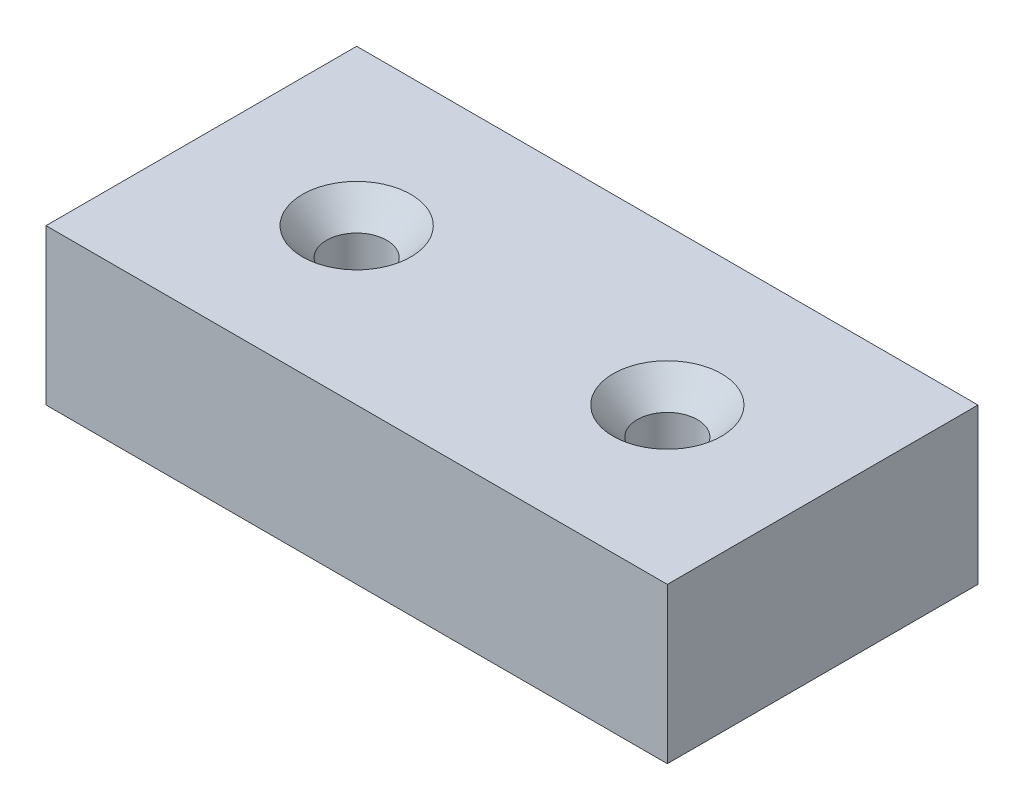
ISO-10303-21;
HEADER;
FILE_DESCRIPTION(('STEP AP214'),'2;1');
FILE_NAME('part.step','',(''),(''),'','','');
FILE_SCHEMA(('AUTOMOTIVE_DESIGN { 1 0 10303 214 1 1 1 1 }'));
ENDSEC;
DATA;
#1=APPLICATION_CONTEXT('core data for automotive mechanical design processes');
#2=APPLICATION_PROTOCOL_DEFINITION('international standard','automotive_design',2000,#1);
#3=PRODUCT_CONTEXT('',#1,'mechanical');
#4=PRODUCT('Part','Part','',(#3));
#5=PRODUCT_RELATED_PRODUCT_CATEGORY('part','',(#4));
#6=PRODUCT_DEFINITION_FORMATION('','',#4);
#7=PRODUCT_DEFINITION_CONTEXT('part definition',#1,'design');
#8=PRODUCT_DEFINITION('design','',#6,#7);
#9=PRODUCT_DEFINITION_SHAPE('','',#8);
#10=(LENGTH_UNIT() NAMED_UNIT(*) SI_UNIT(.MILLI.,.METRE.));
#11=(NAMED_UNIT(*) PLANE_ANGLE_UNIT() SI_UNIT($,.RADIAN.));
#12=(NAMED_UNIT(*) SI_UNIT($,.STERADIAN.) SOLID_ANGLE_UNIT());
#13=UNCERTAINTY_MEASURE_WITH_UNIT(LENGTH_MEASURE(1.E-05),#10,'distance_accuracy_value','');
#14=(GEOMETRIC_REPRESENTATION_CONTEXT(3) GLOBAL_UNCERTAINTY_ASSIGNED_CONTEXT((#13)) GLOBAL_UNIT_ASSIGNED_CONTEXT((#10,
#11,#12)) REPRESENTATION_CONTEXT('',''));
#15=CARTESIAN_POINT('',(0.,0.,0.));
#16=DIRECTION('',(0.,0.,1.));
#17=DIRECTION('',(1.,0.,0.));
#18=AXIS2_PLACEMENT_3D('',#15,#16,#17);
#19=CARTESIAN_POINT('',(-25.4,-6.35,12.7));
#20=DIRECTION('',(0.,0.,1.));
#21=DIRECTION('',(1.,0.,0.));
#22=AXIS2_PLACEMENT_3D('',#19,#20,#21);
#23=PLANE('',#22);
#24=DIRECTION('',(1.,0.,0.));
#25=VECTOR('',#24,1.);
#26=CARTESIAN_POINT('',(-25.4,6.35,12.7));
#27=LINE('',#26,#25);
#28=CARTESIAN_POINT('',(-25.4,6.35,12.7));
#29=VERTEX_POINT('',#28);
#30=CARTESIAN_POINT('',(25.4,6.35,12.7));
#31=VERTEX_POINT('',#30);
#32=EDGE_CURVE('E106',#29,#31,#27,.T.);
#33=ORIENTED_EDGE('',*,*,#32,.F.);
#34=DIRECTION('',(0.,1.,0.));
#35=VECTOR('',#34,1.);
#36=CARTESIAN_POINT('',(-25.4,-6.35,12.7));
#37=LINE('',#36,#35);
#38=CARTESIAN_POINT('',(-25.4,-6.35,12.7));
#39=VERTEX_POINT('',#38);
#40=EDGE_CURVE('E55',#39,#29,#37,.T.);
#41=ORIENTED_EDGE('',*,*,#40,.F.);
#42=DIRECTION('',(1.,0.,0.));
#43=VECTOR('',#42,1.);
#44=CARTESIAN_POINT('',(-25.4,-6.35,12.7));
#45=LINE('',#44,#43);
#46=CARTESIAN_POINT('',(25.4,-6.35,12.7));
#47=VERTEX_POINT('',#46);
#48=EDGE_CURVE('E100',#39,#47,#45,.T.);
#49=ORIENTED_EDGE('',*,*,#48,.T.);
#50=DIRECTION('',(0.,1.,0.));
#51=VECTOR('',#50,1.);
#52=CARTESIAN_POINT('',(25.4,-6.35,12.7));
#53=LINE('',#52,#51);
#54=EDGE_CURVE('E83',#47,#31,#53,.T.);
#55=ORIENTED_EDGE('',*,*,#54,.T.);
#56=EDGE_LOOP('',(#33,#41,#49,#55));
#57=FACE_BOUND('',#56,.T.);
#58=ADVANCED_FACE('F38',(#57),#23,.T.);
#59=CARTESIAN_POINT('',(-25.4,-6.35,-12.7));
#60=DIRECTION('',(-1.,0.,0.));
#61=DIRECTION('',(0.,0.,1.));
#62=AXIS2_PLACEMENT_3D('',#59,#60,#61);
#63=PLANE('',#62);
#64=DIRECTION('',(0.,0.,1.));
#65=VECTOR('',#64,1.);
#66=CARTESIAN_POINT('',(-25.4,6.35,-12.7));
#67=LINE('',#66,#65);
#68=CARTESIAN_POINT('',(-25.4,6.35,-12.7));
#69=VERTEX_POINT('',#68);
#70=EDGE_CURVE('E102',#69,#29,#67,.T.);
#71=ORIENTED_EDGE('',*,*,#70,.F.);
#72=DIRECTION('',(0.,1.,0.));
#73=VECTOR('',#72,1.);
#74=CARTESIAN_POINT('',(-25.4,-6.35,-12.7));
#75=LINE('',#74,#73);
#76=CARTESIAN_POINT('',(-25.4,-6.35,-12.7));
#77=VERTEX_POINT('',#76);
#78=EDGE_CURVE('E72',#77,#69,#75,.T.);
#79=ORIENTED_EDGE('',*,*,#78,.F.);
#80=DIRECTION('',(0.,0.,1.));
#81=VECTOR('',#80,1.);
#82=CARTESIAN_POINT('',(-25.4,-6.35,-12.7));
#83=LINE('',#82,#81);
#84=EDGE_CURVE('E97',#77,#39,#83,.T.);
#85=ORIENTED_EDGE('',*,*,#84,.T.);
#86=ORIENTED_EDGE('',*,*,#40,.T.);
#87=EDGE_LOOP('',(#71,#79,#85,#86));
#88=FACE_BOUND('',#87,.T.);
#89=ADVANCED_FACE('F161',(#88),#63,.T.);
#90=CARTESIAN_POINT('',(25.4,-6.35,-12.7));
#91=DIRECTION('',(0.,0.,-1.));
#92=DIRECTION('',(-1.,0.,0.));
#93=AXIS2_PLACEMENT_3D('',#90,#91,#92);
#94=PLANE('',#93);
#95=DIRECTION('',(-1.,0.,0.));
#96=VECTOR('',#95,1.);
#97=CARTESIAN_POINT('',(25.4,6.35,-12.7));
#98=LINE('',#97,#96);
#99=CARTESIAN_POINT('',(25.4,6.35,-12.7));
#100=VERTEX_POINT('',#99);
#101=EDGE_CURVE('E91',#100,#69,#98,.T.);
#102=ORIENTED_EDGE('',*,*,#101,.F.);
#103=DIRECTION('',(0.,1.,0.));
#104=VECTOR('',#103,1.);
#105=CARTESIAN_POINT('',(25.4,-6.35,-12.7));
#106=LINE('',#105,#104);
#107=CARTESIAN_POINT('',(25.4,-6.35,-12.7));
#108=VERTEX_POINT('',#107);
#109=EDGE_CURVE('E86',#108,#100,#106,.T.);
#110=ORIENTED_EDGE('',*,*,#109,.F.);
#111=DIRECTION('',(-1.,0.,0.));
#112=VECTOR('',#111,1.);
#113=CARTESIAN_POINT('',(25.4,-6.35,-12.7));
#114=LINE('',#113,#112);
#115=EDGE_CURVE('E89',#108,#77,#114,.T.);
#116=ORIENTED_EDGE('',*,*,#115,.T.);
#117=ORIENTED_EDGE('',*,*,#78,.T.);
#118=EDGE_LOOP('',(#102,#110,#116,#117));
#119=FACE_BOUND('',#118,.T.);
#120=ADVANCED_FACE('F88',(#119),#94,.T.);
#121=CARTESIAN_POINT('',(25.4,-6.35,12.7));
#122=DIRECTION('',(1.,0.,0.));
#123=DIRECTION('',(0.,0.,-1.));
#124=AXIS2_PLACEMENT_3D('',#121,#122,#123);
#125=PLANE('',#124);
#126=DIRECTION('',(0.,0.,-1.));
#127=VECTOR('',#126,1.);
#128=CARTESIAN_POINT('',(25.4,6.35,12.7));
#129=LINE('',#128,#127);
#130=EDGE_CURVE('E109',#31,#100,#129,.T.);
#131=ORIENTED_EDGE('',*,*,#130,.F.);
#132=ORIENTED_EDGE('',*,*,#54,.F.);
#133=DIRECTION('',(0.,0.,-1.));
#134=VECTOR('',#133,1.);
#135=CARTESIAN_POINT('',(25.4,-6.35,12.7));
#136=LINE('',#135,#134);
#137=EDGE_CURVE('E96',#47,#108,#136,.T.);
#138=ORIENTED_EDGE('',*,*,#137,.T.);
#139=ORIENTED_EDGE('',*,*,#109,.T.);
#140=EDGE_LOOP('',(#131,#132,#138,#139));
#141=FACE_BOUND('',#140,.T.);
#142=ADVANCED_FACE('F99',(#141),#125,.T.);
#143=CARTESIAN_POINT('',(0.,-6.35,0.));
#144=DIRECTION('',(0.,1.,0.));
#145=DIRECTION('',(0.,0.,1.));
#146=AXIS2_PLACEMENT_3D('',#143,#144,#145);
#147=PLANE('',#146);
#148=CARTESIAN_POINT('',(12.7,-6.35,0.));
#149=DIRECTION('',(0.,1.,0.));
#150=DIRECTION('',(0.,0.,1.));
#151=AXIS2_PLACEMENT_3D('',#148,#149,#150);
#152=CIRCLE('',#151,4.72830022080008);
#153=CARTESIAN_POINT('',(12.7,-6.35,4.72830022080008));
#154=VERTEX_POINT('',#153);
#155=EDGE_CURVE('E120',#154,#154,#152,.T.);
#156=ORIENTED_EDGE('',*,*,#155,.T.);
#157=EDGE_LOOP('',(#156));
#158=FACE_BOUND('',#157,.T.);
#159=CARTESIAN_POINT('',(-12.7,-6.35,0.));
#160=DIRECTION('',(0.,1.,0.));
#161=DIRECTION('',(0.,0.,1.));
#162=AXIS2_PLACEMENT_3D('',#159,#160,#161);
#163=CIRCLE('',#162,4.72830022080008);
#164=CARTESIAN_POINT('',(-12.7,-6.35,4.72830022080008));
#165=VERTEX_POINT('',#164);
#166=EDGE_CURVE('E115',#165,#165,#163,.T.);
#167=ORIENTED_EDGE('',*,*,#166,.T.);
#168=EDGE_LOOP('',(#167));
#169=FACE_BOUND('',#168,.T.);
#170=ORIENTED_EDGE('',*,*,#48,.F.);
#171=ORIENTED_EDGE('',*,*,#84,.F.);
#172=ORIENTED_EDGE('',*,*,#115,.F.);
#173=ORIENTED_EDGE('',*,*,#137,.F.);
#174=EDGE_LOOP('',(#170,#171,#172,#173));
#175=FACE_BOUND('',#174,.T.);
#176=ADVANCED_FACE('F95',(#158,#169,#175),#147,.F.);
#177=CARTESIAN_POINT('',(0.,6.35,0.));
#178=DIRECTION('',(0.,1.,0.));
#179=DIRECTION('',(0.,0.,1.));
#180=AXIS2_PLACEMENT_3D('',#177,#178,#179);
#181=PLANE('',#180);
#182=CARTESIAN_POINT('',(-12.7,6.35,0.));
#183=DIRECTION('',(0.,1.,0.));
#184=DIRECTION('',(0.,0.,1.));
#185=AXIS2_PLACEMENT_3D('',#182,#183,#184);
#186=CIRCLE('',#185,4.4323000000001);
#187=CARTESIAN_POINT('',(-12.7,6.35,4.4323000000001));
#188=VERTEX_POINT('',#187);
#189=EDGE_CURVE('E11',#188,#188,#186,.F.);
#190=ORIENTED_EDGE('',*,*,#189,.T.);
#191=EDGE_LOOP('',(#190));
#192=FACE_BOUND('',#191,.T.);
#193=CARTESIAN_POINT('',(12.7,6.35,0.));
#194=DIRECTION('',(0.,1.,0.));
#195=DIRECTION('',(0.,0.,1.));
#196=AXIS2_PLACEMENT_3D('',#193,#194,#195);
#197=CIRCLE('',#196,4.4323000000001);
#198=CARTESIAN_POINT('',(12.7,6.35,4.4323000000001));
#199=VERTEX_POINT('',#198);
#200=EDGE_CURVE('E47',#199,#199,#197,.F.);
#201=ORIENTED_EDGE('',*,*,#200,.T.);
#202=EDGE_LOOP('',(#201));
#203=FACE_BOUND('',#202,.T.);
#204=ORIENTED_EDGE('',*,*,#32,.T.);
#205=ORIENTED_EDGE('',*,*,#130,.T.);
#206=ORIENTED_EDGE('',*,*,#101,.T.);
#207=ORIENTED_EDGE('',*,*,#70,.T.);
#208=EDGE_LOOP('',(#204,#205,#206,#207));
#209=FACE_BOUND('',#208,.T.);
#210=ADVANCED_FACE('F137',(#192,#203,#209),#181,.T.);
#211=CARTESIAN_POINT('',(12.7,6.35,0.));
#212=DIRECTION('',(0.,1.,0.));
#213=DIRECTION('',(0.,0.,1.));
#214=AXIS2_PLACEMENT_3D('',#211,#212,#213);
#215=CYLINDRICAL_SURFACE('',#214,2.46380000000001);
#216=CARTESIAN_POINT('',(12.7,-4.38149999999993,0.));
#217=DIRECTION('',(0.,1.,0.));
#218=DIRECTION('',(0.,0.,1.));
#219=AXIS2_PLACEMENT_3D('',#216,#217,#218);
#220=CIRCLE('',#219,2.46380000000001);
#221=CARTESIAN_POINT('',(12.7,-4.38149999999993,2.46380000000001));
#222=VERTEX_POINT('',#221);
#223=EDGE_CURVE('E126',#222,#222,#220,.F.);
#224=ORIENTED_EDGE('',*,*,#223,.T.);
#225=EDGE_LOOP('',(#224));
#226=FACE_BOUND('',#225,.T.);
#227=CARTESIAN_POINT('',(12.7,4.08549977919992,0.));
#228=DIRECTION('',(0.,1.,0.));
#229=DIRECTION('',(0.,0.,1.));
#230=AXIS2_PLACEMENT_3D('',#227,#228,#229);
#231=CIRCLE('',#230,2.46380000000001);
#232=CARTESIAN_POINT('',(12.7,4.08549977919992,2.46380000000001));
#233=VERTEX_POINT('',#232);
#234=EDGE_CURVE('E123',#233,#233,#231,.T.);
#235=ORIENTED_EDGE('',*,*,#234,.T.);
#236=EDGE_LOOP('',(#235));
#237=FACE_BOUND('',#236,.T.);
#238=ADVANCED_FACE('F145',(#226,#237),#215,.F.);
#239=CARTESIAN_POINT('',(-12.7,6.35,0.));
#240=DIRECTION('',(0.,1.,0.));
#241=DIRECTION('',(0.,0.,1.));
#242=AXIS2_PLACEMENT_3D('',#239,#240,#241);
#243=CYLINDRICAL_SURFACE('',#242,2.46380000000001);
#244=CARTESIAN_POINT('',(-12.7,-4.38149999999993,0.));
#245=DIRECTION('',(0.,1.,0.));
#246=DIRECTION('',(0.,0.,1.));
#247=AXIS2_PLACEMENT_3D('',#244,#245,#246);
#248=CIRCLE('',#247,2.46380000000001);
#249=CARTESIAN_POINT('',(-12.7,-4.38149999999993,2.46380000000001));
#250=VERTEX_POINT('',#249);
#251=EDGE_CURVE('E132',#250,#250,#248,.F.);
#252=ORIENTED_EDGE('',*,*,#251,.T.);
#253=EDGE_LOOP('',(#252));
#254=FACE_BOUND('',#253,.T.);
#255=CARTESIAN_POINT('',(-12.7,4.08549977919992,0.));
#256=DIRECTION('',(0.,1.,0.));
#257=DIRECTION('',(0.,0.,1.));
#258=AXIS2_PLACEMENT_3D('',#255,#256,#257);
#259=CIRCLE('',#258,2.46380000000001);
#260=CARTESIAN_POINT('',(-12.7,4.08549977919992,2.46380000000001));
#261=VERTEX_POINT('',#260);
#262=EDGE_CURVE('E129',#261,#261,#259,.T.);
#263=ORIENTED_EDGE('',*,*,#262,.T.);
#264=EDGE_LOOP('',(#263));
#265=FACE_BOUND('',#264,.T.);
#266=ADVANCED_FACE('F147',(#254,#265),#243,.F.);
#267=CARTESIAN_POINT('',(12.7,-6.35,0.));
#268=DIRECTION('',(0.,-1.,0.));
#269=DIRECTION('',(0.,0.,-1.));
#270=AXIS2_PLACEMENT_3D('',#267,#268,#269);
#271=CONICAL_SURFACE('',#270,4.72830022080008,0.855211335922921);
#272=ORIENTED_EDGE('',*,*,#223,.F.);
#273=EDGE_LOOP('',(#272));
#274=FACE_BOUND('',#273,.T.);
#275=ORIENTED_EDGE('',*,*,#155,.F.);
#276=EDGE_LOOP('',(#275));
#277=FACE_BOUND('',#276,.T.);
#278=ADVANCED_FACE('F154',(#274,#277),#271,.F.);
#279=CARTESIAN_POINT('',(-12.7,-6.35,0.));
#280=DIRECTION('',(0.,-1.,0.));
#281=DIRECTION('',(0.,0.,-1.));
#282=AXIS2_PLACEMENT_3D('',#279,#280,#281);
#283=CONICAL_SURFACE('',#282,4.72830022080008,0.855211335922921);
#284=ORIENTED_EDGE('',*,*,#251,.F.);
#285=EDGE_LOOP('',(#284));
#286=FACE_BOUND('',#285,.T.);
#287=ORIENTED_EDGE('',*,*,#166,.F.);
#288=EDGE_LOOP('',(#287));
#289=FACE_BOUND('',#288,.T.);
#290=ADVANCED_FACE('F172',(#286,#289),#283,.F.);
#291=CARTESIAN_POINT('',(-12.7,4.08549977919992,0.));
#292=DIRECTION('',(0.,1.,0.));
#293=DIRECTION('',(0.,0.,1.));
#294=AXIS2_PLACEMENT_3D('',#291,#292,#293);
#295=CONICAL_SURFACE('',#294,2.46380000000001,0.715584990871977);
#296=ORIENTED_EDGE('',*,*,#189,.F.);
#297=EDGE_LOOP('',(#296));
#298=FACE_BOUND('',#297,.T.);
#299=ORIENTED_EDGE('',*,*,#262,.F.);
#300=EDGE_LOOP('',(#299));
#301=FACE_BOUND('',#300,.T.);
#302=ADVANCED_FACE('F142',(#298,#301),#295,.F.);
#303=CARTESIAN_POINT('',(12.7,4.08549977919992,0.));
#304=DIRECTION('',(0.,1.,0.));
#305=DIRECTION('',(0.,0.,1.));
#306=AXIS2_PLACEMENT_3D('',#303,#304,#305);
#307=CONICAL_SURFACE('',#306,2.46380000000001,0.715584990871977);
#308=ORIENTED_EDGE('',*,*,#200,.F.);
#309=EDGE_LOOP('',(#308));
#310=FACE_BOUND('',#309,.T.);
#311=ORIENTED_EDGE('',*,*,#234,.F.);
#312=EDGE_LOOP('',(#311));
#313=FACE_BOUND('',#312,.T.);
#314=ADVANCED_FACE('F40',(#310,#313),#307,.F.);
#315=CLOSED_SHELL('',(#58,#89,#120,#142,#176,#210,#238,#266,#278,#290,#302,#314));
#316=MANIFOLD_SOLID_BREP('B2',#315);
#317=ADVANCED_BREP_SHAPE_REPRESENTATION('',(#18,#316),#14);
#318=SHAPE_DEFINITION_REPRESENTATION(#9,#317);
ENDSEC;
END-ISO-10303-21;
